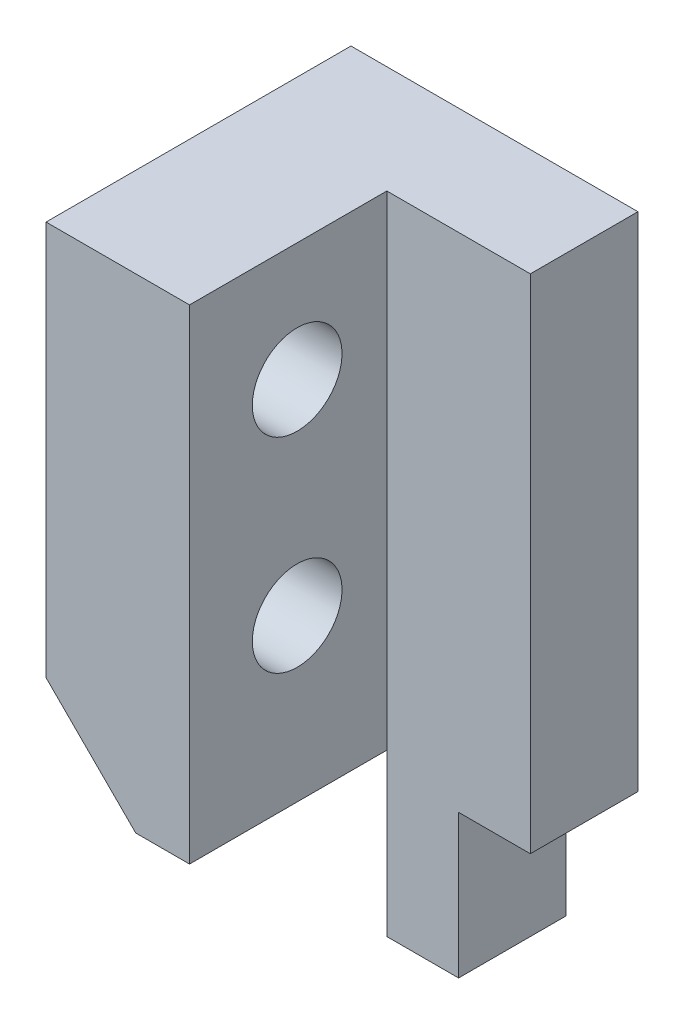
ISO-10303-21;
HEADER;
FILE_DESCRIPTION(('STEP AP214'),'2;1');
FILE_NAME('part.step','',(''),(''),'','','');
FILE_SCHEMA(('AUTOMOTIVE_DESIGN { 1 0 10303 214 1 1 1 1 }'));
ENDSEC;
DATA;
#1=APPLICATION_CONTEXT('core data for automotive mechanical design processes');
#2=APPLICATION_PROTOCOL_DEFINITION('international standard','automotive_design',2000,#1);
#3=PRODUCT_CONTEXT('',#1,'mechanical');
#4=PRODUCT('Part','Part','',(#3));
#5=PRODUCT_RELATED_PRODUCT_CATEGORY('part','',(#4));
#6=PRODUCT_DEFINITION_FORMATION('','',#4);
#7=PRODUCT_DEFINITION_CONTEXT('part definition',#1,'design');
#8=PRODUCT_DEFINITION('design','',#6,#7);
#9=PRODUCT_DEFINITION_SHAPE('','',#8);
#10=(LENGTH_UNIT() NAMED_UNIT(*) SI_UNIT(.MILLI.,.METRE.));
#11=(NAMED_UNIT(*) PLANE_ANGLE_UNIT() SI_UNIT($,.RADIAN.));
#12=(NAMED_UNIT(*) SI_UNIT($,.STERADIAN.) SOLID_ANGLE_UNIT());
#13=UNCERTAINTY_MEASURE_WITH_UNIT(LENGTH_MEASURE(1.E-05),#10,'distance_accuracy_value','');
#14=(GEOMETRIC_REPRESENTATION_CONTEXT(3) GLOBAL_UNCERTAINTY_ASSIGNED_CONTEXT((#13)) GLOBAL_UNIT_ASSIGNED_CONTEXT((#10,
#11,#12)) REPRESENTATION_CONTEXT('',''));
#15=CARTESIAN_POINT('',(0.,0.,0.));
#16=DIRECTION('',(0.,0.,1.));
#17=DIRECTION('',(1.,0.,0.));
#18=AXIS2_PLACEMENT_3D('',#15,#16,#17);
#19=CARTESIAN_POINT('',(0.,0.,8.5));
#20=DIRECTION('',(1.,0.,0.));
#21=DIRECTION('',(0.,0.,-1.));
#22=AXIS2_PLACEMENT_3D('',#19,#20,#21);
#23=PLANE('',#22);
#24=CARTESIAN_POINT('',(0.,14.7,5.5));
#25=DIRECTION('',(-1.,0.,0.));
#26=DIRECTION('',(0.,0.,1.));
#27=AXIS2_PLACEMENT_3D('',#24,#25,#26);
#28=CIRCLE('',#27,1.24999999999999);
#29=CARTESIAN_POINT('',(0.,14.7,6.74999999999999));
#30=VERTEX_POINT('',#29);
#31=EDGE_CURVE('E171',#30,#30,#28,.T.);
#32=ORIENTED_EDGE('',*,*,#31,.F.);
#33=EDGE_LOOP('',(#32));
#34=FACE_BOUND('',#33,.T.);
#35=CARTESIAN_POINT('',(0.,9.,5.5));
#36=DIRECTION('',(-1.,0.,0.));
#37=DIRECTION('',(0.,0.,1.));
#38=AXIS2_PLACEMENT_3D('',#35,#36,#37);
#39=CIRCLE('',#38,1.24999999999999);
#40=CARTESIAN_POINT('',(0.,9.,6.74999999999999));
#41=VERTEX_POINT('',#40);
#42=EDGE_CURVE('E170',#41,#41,#39,.T.);
#43=ORIENTED_EDGE('',*,*,#42,.F.);
#44=EDGE_LOOP('',(#43));
#45=FACE_BOUND('',#44,.T.);
#46=DIRECTION('',(0.,-1.,0.));
#47=VECTOR('',#46,1.);
#48=CARTESIAN_POINT('',(0.,0.,0.));
#49=LINE('',#48,#47);
#50=CARTESIAN_POINT('',(0.,18.,0.));
#51=VERTEX_POINT('',#50);
#52=CARTESIAN_POINT('',(0.,7.00000000000001,0.));
#53=VERTEX_POINT('',#52);
#54=EDGE_CURVE('E138',#51,#53,#49,.T.);
#55=ORIENTED_EDGE('',*,*,#54,.T.);
#56=DIRECTION('',(0.,0.,1.));
#57=VECTOR('',#56,1.);
#58=CARTESIAN_POINT('',(0.,7.00000000000001,8.5));
#59=LINE('',#58,#57);
#60=CARTESIAN_POINT('',(0.,7.00000000000001,8.5));
#61=VERTEX_POINT('',#60);
#62=EDGE_CURVE('E41',#53,#61,#59,.T.);
#63=ORIENTED_EDGE('',*,*,#62,.T.);
#64=DIRECTION('',(0.,-1.,0.));
#65=VECTOR('',#64,1.);
#66=CARTESIAN_POINT('',(0.,0.,8.5));
#67=LINE('',#66,#65);
#68=CARTESIAN_POINT('',(0.,18.,8.5));
#69=VERTEX_POINT('',#68);
#70=EDGE_CURVE('E151',#69,#61,#67,.T.);
#71=ORIENTED_EDGE('',*,*,#70,.F.);
#72=DIRECTION('',(0.,0.,-1.));
#73=VECTOR('',#72,1.);
#74=CARTESIAN_POINT('',(0.,18.,8.5));
#75=LINE('',#74,#73);
#76=EDGE_CURVE('E155',#69,#51,#75,.T.);
#77=ORIENTED_EDGE('',*,*,#76,.T.);
#78=EDGE_LOOP('',(#55,#63,#71,#77));
#79=FACE_BOUND('',#78,.T.);
#80=ADVANCED_FACE('F33',(#34,#45,#79),#23,.F.);
#81=CARTESIAN_POINT('',(0.,0.,8.5));
#82=DIRECTION('',(0.,1.,0.));
#83=DIRECTION('',(0.,0.,1.));
#84=AXIS2_PLACEMENT_3D('',#81,#82,#83);
#85=PLANE('',#84);
#86=DIRECTION('',(-1.,0.,0.));
#87=VECTOR('',#86,1.);
#88=CARTESIAN_POINT('',(8.,0.,3.));
#89=LINE('',#88,#87);
#90=CARTESIAN_POINT('',(6.,0.,3.));
#91=VERTEX_POINT('',#90);
#92=CARTESIAN_POINT('',(4.,0.,3.));
#93=VERTEX_POINT('',#92);
#94=EDGE_CURVE('E150',#91,#93,#89,.T.);
#95=ORIENTED_EDGE('',*,*,#94,.T.);
#96=DIRECTION('',(0.,0.,-1.));
#97=VECTOR('',#96,1.);
#98=CARTESIAN_POINT('',(4.,0.,8.5));
#99=LINE('',#98,#97);
#100=CARTESIAN_POINT('',(4.,0.,0.));
#101=VERTEX_POINT('',#100);
#102=EDGE_CURVE('E132',#93,#101,#99,.T.);
#103=ORIENTED_EDGE('',*,*,#102,.T.);
#104=DIRECTION('',(1.,0.,0.));
#105=VECTOR('',#104,1.);
#106=CARTESIAN_POINT('',(0.,0.,0.));
#107=LINE('',#106,#105);
#108=CARTESIAN_POINT('',(6.,0.,0.));
#109=VERTEX_POINT('',#108);
#110=EDGE_CURVE('E141',#101,#109,#107,.T.);
#111=ORIENTED_EDGE('',*,*,#110,.T.);
#112=DIRECTION('',(0.,0.,1.));
#113=VECTOR('',#112,1.);
#114=CARTESIAN_POINT('',(6.,0.,0.));
#115=LINE('',#114,#113);
#116=EDGE_CURVE('E195',#109,#91,#115,.T.);
#117=ORIENTED_EDGE('',*,*,#116,.T.);
#118=EDGE_LOOP('',(#95,#103,#111,#117));
#119=FACE_BOUND('',#118,.T.);
#120=ADVANCED_FACE('F227',(#119),#85,.F.);
#121=CARTESIAN_POINT('',(8.,0.,8.5));
#122=DIRECTION('',(-1.,0.,0.));
#123=DIRECTION('',(0.,0.,1.));
#124=AXIS2_PLACEMENT_3D('',#121,#122,#123);
#125=PLANE('',#124);
#126=DIRECTION('',(0.,1.,0.));
#127=VECTOR('',#126,1.);
#128=CARTESIAN_POINT('',(8.,0.,3.));
#129=LINE('',#128,#127);
#130=CARTESIAN_POINT('',(8.,4.,3.));
#131=VERTEX_POINT('',#130);
#132=CARTESIAN_POINT('',(8.,18.,3.));
#133=VERTEX_POINT('',#132);
#134=EDGE_CURVE('E148',#131,#133,#129,.T.);
#135=ORIENTED_EDGE('',*,*,#134,.F.);
#136=DIRECTION('',(0.,0.,1.));
#137=VECTOR('',#136,1.);
#138=CARTESIAN_POINT('',(8.,4.,0.));
#139=LINE('',#138,#137);
#140=CARTESIAN_POINT('',(8.,4.,0.));
#141=VERTEX_POINT('',#140);
#142=EDGE_CURVE('E191',#141,#131,#139,.T.);
#143=ORIENTED_EDGE('',*,*,#142,.F.);
#144=DIRECTION('',(0.,1.,0.));
#145=VECTOR('',#144,1.);
#146=CARTESIAN_POINT('',(8.,0.,0.));
#147=LINE('',#146,#145);
#148=CARTESIAN_POINT('',(8.,18.,0.));
#149=VERTEX_POINT('',#148);
#150=EDGE_CURVE('E158',#141,#149,#147,.T.);
#151=ORIENTED_EDGE('',*,*,#150,.T.);
#152=DIRECTION('',(0.,0.,-1.));
#153=VECTOR('',#152,1.);
#154=CARTESIAN_POINT('',(8.,18.,8.5));
#155=LINE('',#154,#153);
#156=EDGE_CURVE('E163',#133,#149,#155,.T.);
#157=ORIENTED_EDGE('',*,*,#156,.F.);
#158=EDGE_LOOP('',(#135,#143,#151,#157));
#159=FACE_BOUND('',#158,.T.);
#160=ADVANCED_FACE('F232',(#159),#125,.F.);
#161=CARTESIAN_POINT('',(0.,18.,8.5));
#162=DIRECTION('',(0.,-1.,0.));
#163=DIRECTION('',(0.,0.,-1.));
#164=AXIS2_PLACEMENT_3D('',#161,#162,#163);
#165=PLANE('',#164);
#166=DIRECTION('',(-1.,0.,0.));
#167=VECTOR('',#166,1.);
#168=CARTESIAN_POINT('',(0.,18.,8.5));
#169=LINE('',#168,#167);
#170=CARTESIAN_POINT('',(4.,18.,8.5));
#171=VERTEX_POINT('',#170);
#172=EDGE_CURVE('E153',#171,#69,#169,.T.);
#173=ORIENTED_EDGE('',*,*,#172,.F.);
#174=DIRECTION('',(0.,0.,1.));
#175=VECTOR('',#174,1.);
#176=CARTESIAN_POINT('',(4.,18.,8.5));
#177=LINE('',#176,#175);
#178=CARTESIAN_POINT('',(4.,18.,3.));
#179=VERTEX_POINT('',#178);
#180=EDGE_CURVE('E136',#179,#171,#177,.T.);
#181=ORIENTED_EDGE('',*,*,#180,.F.);
#182=DIRECTION('',(-1.,0.,0.));
#183=VECTOR('',#182,1.);
#184=CARTESIAN_POINT('',(8.,18.,3.));
#185=LINE('',#184,#183);
#186=EDGE_CURVE('E208',#133,#179,#185,.T.);
#187=ORIENTED_EDGE('',*,*,#186,.F.);
#188=ORIENTED_EDGE('',*,*,#156,.T.);
#189=DIRECTION('',(-1.,0.,0.));
#190=VECTOR('',#189,1.);
#191=CARTESIAN_POINT('',(0.,18.,0.));
#192=LINE('',#191,#190);
#193=EDGE_CURVE('E154',#149,#51,#192,.T.);
#194=ORIENTED_EDGE('',*,*,#193,.T.);
#195=ORIENTED_EDGE('',*,*,#76,.F.);
#196=EDGE_LOOP('',(#173,#181,#187,#188,#194,#195));
#197=FACE_BOUND('',#196,.T.);
#198=ADVANCED_FACE('F218',(#197),#165,.F.);
#199=CARTESIAN_POINT('',(0.,18.,8.5));
#200=DIRECTION('',(0.,0.,-1.));
#201=DIRECTION('',(-1.,0.,0.));
#202=AXIS2_PLACEMENT_3D('',#199,#200,#201);
#203=PLANE('',#202);
#204=ORIENTED_EDGE('',*,*,#70,.T.);
#205=DIRECTION('',(-0.707106781186546,0.707106781186549,0.));
#206=VECTOR('',#205,1.);
#207=CARTESIAN_POINT('',(2.5,4.5,8.5));
#208=LINE('',#207,#206);
#209=CARTESIAN_POINT('',(2.5,4.5,8.5));
#210=VERTEX_POINT('',#209);
#211=EDGE_CURVE('E11',#61,#210,#208,.F.);
#212=ORIENTED_EDGE('',*,*,#211,.T.);
#213=DIRECTION('',(1.,0.,0.));
#214=VECTOR('',#213,1.);
#215=CARTESIAN_POINT('',(0.,4.5,8.5));
#216=LINE('',#215,#214);
#217=CARTESIAN_POINT('',(4.,4.5,8.5));
#218=VERTEX_POINT('',#217);
#219=EDGE_CURVE('E112',#210,#218,#216,.T.);
#220=ORIENTED_EDGE('',*,*,#219,.T.);
#221=DIRECTION('',(0.,1.,0.));
#222=VECTOR('',#221,1.);
#223=CARTESIAN_POINT('',(4.,0.,8.5));
#224=LINE('',#223,#222);
#225=EDGE_CURVE('E116',#218,#171,#224,.T.);
#226=ORIENTED_EDGE('',*,*,#225,.T.);
#227=ORIENTED_EDGE('',*,*,#172,.T.);
#228=EDGE_LOOP('',(#204,#212,#220,#226,#227));
#229=FACE_BOUND('',#228,.T.);
#230=ADVANCED_FACE('F114',(#229),#203,.F.);
#231=CARTESIAN_POINT('',(0.,18.,0.));
#232=DIRECTION('',(0.,0.,-1.));
#233=DIRECTION('',(-1.,0.,0.));
#234=AXIS2_PLACEMENT_3D('',#231,#232,#233);
#235=PLANE('',#234);
#236=DIRECTION('',(1.,0.,0.));
#237=VECTOR('',#236,1.);
#238=CARTESIAN_POINT('',(0.,4.5,0.));
#239=LINE('',#238,#237);
#240=CARTESIAN_POINT('',(2.5,4.5,0.));
#241=VERTEX_POINT('',#240);
#242=CARTESIAN_POINT('',(4.,4.5,0.));
#243=VERTEX_POINT('',#242);
#244=EDGE_CURVE('E173',#241,#243,#239,.T.);
#245=ORIENTED_EDGE('',*,*,#244,.F.);
#246=DIRECTION('',(0.707106781186546,-0.707106781186549,0.));
#247=VECTOR('',#246,1.);
#248=CARTESIAN_POINT('',(-5.5,12.5,0.));
#249=LINE('',#248,#247);
#250=EDGE_CURVE('E55',#241,#53,#249,.F.);
#251=ORIENTED_EDGE('',*,*,#250,.T.);
#252=ORIENTED_EDGE('',*,*,#54,.F.);
#253=ORIENTED_EDGE('',*,*,#193,.F.);
#254=ORIENTED_EDGE('',*,*,#150,.F.);
#255=DIRECTION('',(-1.,0.,0.));
#256=VECTOR('',#255,1.);
#257=CARTESIAN_POINT('',(8.,4.,0.));
#258=LINE('',#257,#256);
#259=CARTESIAN_POINT('',(6.,4.,0.));
#260=VERTEX_POINT('',#259);
#261=EDGE_CURVE('E184',#141,#260,#258,.T.);
#262=ORIENTED_EDGE('',*,*,#261,.T.);
#263=DIRECTION('',(0.,-1.,0.));
#264=VECTOR('',#263,1.);
#265=CARTESIAN_POINT('',(6.,0.,0.));
#266=LINE('',#265,#264);
#267=EDGE_CURVE('E187',#260,#109,#266,.T.);
#268=ORIENTED_EDGE('',*,*,#267,.T.);
#269=ORIENTED_EDGE('',*,*,#110,.F.);
#270=DIRECTION('',(0.,-1.,0.));
#271=VECTOR('',#270,1.);
#272=CARTESIAN_POINT('',(4.,0.,0.));
#273=LINE('',#272,#271);
#274=EDGE_CURVE('E123',#243,#101,#273,.T.);
#275=ORIENTED_EDGE('',*,*,#274,.F.);
#276=EDGE_LOOP('',(#245,#251,#252,#253,#254,#262,#268,#269,#275));
#277=FACE_BOUND('',#276,.T.);
#278=ADVANCED_FACE('F176',(#277),#235,.T.);
#279=CARTESIAN_POINT('',(4.,0.,8.5));
#280=DIRECTION('',(-1.,0.,0.));
#281=DIRECTION('',(0.,0.,1.));
#282=AXIS2_PLACEMENT_3D('',#279,#280,#281);
#283=PLANE('',#282);
#284=CARTESIAN_POINT('',(4.,14.7,5.5));
#285=DIRECTION('',(-1.,0.,0.));
#286=DIRECTION('',(0.,0.,1.));
#287=AXIS2_PLACEMENT_3D('',#284,#285,#286);
#288=CIRCLE('',#287,1.24999999999999);
#289=CARTESIAN_POINT('',(4.,14.7,6.74999999999999));
#290=VERTEX_POINT('',#289);
#291=EDGE_CURVE('E167',#290,#290,#288,.T.);
#292=ORIENTED_EDGE('',*,*,#291,.T.);
#293=EDGE_LOOP('',(#292));
#294=FACE_BOUND('',#293,.T.);
#295=CARTESIAN_POINT('',(4.,9.,5.5));
#296=DIRECTION('',(-1.,0.,0.));
#297=DIRECTION('',(0.,0.,1.));
#298=AXIS2_PLACEMENT_3D('',#295,#296,#297);
#299=CIRCLE('',#298,1.24999999999999);
#300=CARTESIAN_POINT('',(4.,9.,6.74999999999999));
#301=VERTEX_POINT('',#300);
#302=EDGE_CURVE('E205',#301,#301,#299,.T.);
#303=ORIENTED_EDGE('',*,*,#302,.T.);
#304=EDGE_LOOP('',(#303));
#305=FACE_BOUND('',#304,.T.);
#306=ORIENTED_EDGE('',*,*,#225,.F.);
#307=DIRECTION('',(0.,0.,-1.));
#308=VECTOR('',#307,1.);
#309=CARTESIAN_POINT('',(4.,4.5,8.5));
#310=LINE('',#309,#308);
#311=CARTESIAN_POINT('',(4.,4.5,3.));
#312=VERTEX_POINT('',#311);
#313=EDGE_CURVE('E127',#218,#312,#310,.T.);
#314=ORIENTED_EDGE('',*,*,#313,.T.);
#315=DIRECTION('',(0.,1.,0.));
#316=VECTOR('',#315,1.);
#317=CARTESIAN_POINT('',(4.,0.,3.));
#318=LINE('',#317,#316);
#319=EDGE_CURVE('E143',#312,#179,#318,.T.);
#320=ORIENTED_EDGE('',*,*,#319,.T.);
#321=ORIENTED_EDGE('',*,*,#180,.T.);
#322=EDGE_LOOP('',(#306,#314,#320,#321));
#323=FACE_BOUND('',#322,.T.);
#324=ADVANCED_FACE('F134',(#294,#305,#323),#283,.F.);
#325=CARTESIAN_POINT('',(8.,0.,3.));
#326=DIRECTION('',(0.,0.,-1.));
#327=DIRECTION('',(-1.,0.,0.));
#328=AXIS2_PLACEMENT_3D('',#325,#326,#327);
#329=PLANE('',#328);
#330=EDGE_CURVE('E139',#93,#312,#318,.T.);
#331=ORIENTED_EDGE('',*,*,#330,.F.);
#332=ORIENTED_EDGE('',*,*,#94,.F.);
#333=DIRECTION('',(0.,-1.,0.));
#334=VECTOR('',#333,1.);
#335=CARTESIAN_POINT('',(6.,0.,3.));
#336=LINE('',#335,#334);
#337=CARTESIAN_POINT('',(6.,4.,3.));
#338=VERTEX_POINT('',#337);
#339=EDGE_CURVE('E188',#338,#91,#336,.T.);
#340=ORIENTED_EDGE('',*,*,#339,.F.);
#341=DIRECTION('',(-1.,0.,0.));
#342=VECTOR('',#341,1.);
#343=CARTESIAN_POINT('',(8.,4.,3.));
#344=LINE('',#343,#342);
#345=EDGE_CURVE('E182',#131,#338,#344,.T.);
#346=ORIENTED_EDGE('',*,*,#345,.F.);
#347=ORIENTED_EDGE('',*,*,#134,.T.);
#348=ORIENTED_EDGE('',*,*,#186,.T.);
#349=ORIENTED_EDGE('',*,*,#319,.F.);
#350=EDGE_LOOP('',(#331,#332,#340,#346,#347,#348,#349));
#351=FACE_BOUND('',#350,.T.);
#352=ADVANCED_FACE('F213',(#351),#329,.F.);
#353=CARTESIAN_POINT('',(0.,9.,5.5));
#354=DIRECTION('',(-1.,0.,0.));
#355=DIRECTION('',(0.,0.,1.));
#356=AXIS2_PLACEMENT_3D('',#353,#354,#355);
#357=CYLINDRICAL_SURFACE('',#356,1.24999999999999);
#358=ORIENTED_EDGE('',*,*,#42,.T.);
#359=EDGE_LOOP('',(#358));
#360=FACE_BOUND('',#359,.T.);
#361=ORIENTED_EDGE('',*,*,#302,.F.);
#362=EDGE_LOOP('',(#361));
#363=FACE_BOUND('',#362,.T.);
#364=ADVANCED_FACE('F249',(#360,#363),#357,.F.);
#365=CARTESIAN_POINT('',(0.,14.7,5.5));
#366=DIRECTION('',(-1.,0.,0.));
#367=DIRECTION('',(0.,0.,1.));
#368=AXIS2_PLACEMENT_3D('',#365,#366,#367);
#369=CYLINDRICAL_SURFACE('',#368,1.24999999999999);
#370=ORIENTED_EDGE('',*,*,#31,.T.);
#371=EDGE_LOOP('',(#370));
#372=FACE_BOUND('',#371,.T.);
#373=ORIENTED_EDGE('',*,*,#291,.F.);
#374=EDGE_LOOP('',(#373));
#375=FACE_BOUND('',#374,.T.);
#376=ADVANCED_FACE('F255',(#372,#375),#369,.F.);
#377=CARTESIAN_POINT('',(6.,0.,0.));
#378=DIRECTION('',(-1.,0.,0.));
#379=DIRECTION('',(0.,0.,1.));
#380=AXIS2_PLACEMENT_3D('',#377,#378,#379);
#381=PLANE('',#380);
#382=ORIENTED_EDGE('',*,*,#339,.T.);
#383=ORIENTED_EDGE('',*,*,#116,.F.);
#384=ORIENTED_EDGE('',*,*,#267,.F.);
#385=DIRECTION('',(0.,0.,1.));
#386=VECTOR('',#385,1.);
#387=CARTESIAN_POINT('',(6.,4.,0.));
#388=LINE('',#387,#386);
#389=EDGE_CURVE('E198',#260,#338,#388,.T.);
#390=ORIENTED_EDGE('',*,*,#389,.T.);
#391=EDGE_LOOP('',(#382,#383,#384,#390));
#392=FACE_BOUND('',#391,.T.);
#393=ADVANCED_FACE('F259',(#392),#381,.F.);
#394=CARTESIAN_POINT('',(8.,4.,0.));
#395=DIRECTION('',(0.,1.,0.));
#396=DIRECTION('',(0.,0.,1.));
#397=AXIS2_PLACEMENT_3D('',#394,#395,#396);
#398=PLANE('',#397);
#399=ORIENTED_EDGE('',*,*,#345,.T.);
#400=ORIENTED_EDGE('',*,*,#389,.F.);
#401=ORIENTED_EDGE('',*,*,#261,.F.);
#402=ORIENTED_EDGE('',*,*,#142,.T.);
#403=EDGE_LOOP('',(#399,#400,#401,#402));
#404=FACE_BOUND('',#403,.T.);
#405=ADVANCED_FACE('F261',(#404),#398,.F.);
#406=CARTESIAN_POINT('',(4.,0.,8.5));
#407=DIRECTION('',(1.,0.,0.));
#408=DIRECTION('',(0.,0.,-1.));
#409=AXIS2_PLACEMENT_3D('',#406,#407,#408);
#410=PLANE('',#409);
#411=EDGE_CURVE('E122',#312,#243,#310,.T.);
#412=ORIENTED_EDGE('',*,*,#411,.T.);
#413=ORIENTED_EDGE('',*,*,#274,.T.);
#414=ORIENTED_EDGE('',*,*,#102,.F.);
#415=ORIENTED_EDGE('',*,*,#330,.T.);
#416=EDGE_LOOP('',(#412,#413,#414,#415));
#417=FACE_BOUND('',#416,.T.);
#418=ADVANCED_FACE('F224',(#417),#410,.F.);
#419=CARTESIAN_POINT('',(0.,4.5,8.5));
#420=DIRECTION('',(0.,1.,0.));
#421=DIRECTION('',(-1.,0.,0.));
#422=AXIS2_PLACEMENT_3D('',#419,#420,#421);
#423=PLANE('',#422);
#424=ORIENTED_EDGE('',*,*,#219,.F.);
#425=DIRECTION('',(0.,0.,-1.));
#426=VECTOR('',#425,1.);
#427=CARTESIAN_POINT('',(2.5,4.5,8.5));
#428=LINE('',#427,#426);
#429=EDGE_CURVE('E166',#210,#241,#428,.T.);
#430=ORIENTED_EDGE('',*,*,#429,.T.);
#431=ORIENTED_EDGE('',*,*,#244,.T.);
#432=ORIENTED_EDGE('',*,*,#411,.F.);
#433=ORIENTED_EDGE('',*,*,#313,.F.);
#434=EDGE_LOOP('',(#424,#430,#431,#432,#433));
#435=FACE_BOUND('',#434,.T.);
#436=ADVANCED_FACE('F128',(#435),#423,.F.);
#437=CARTESIAN_POINT('',(2.5,4.5,8.5));
#438=DIRECTION('',(0.707106781186549,0.707106781186546,0.));
#439=DIRECTION('',(-0.707106781186546,0.707106781186549,0.));
#440=AXIS2_PLACEMENT_3D('',#437,#438,#439);
#441=PLANE('',#440);
#442=ORIENTED_EDGE('',*,*,#211,.F.);
#443=ORIENTED_EDGE('',*,*,#62,.F.);
#444=ORIENTED_EDGE('',*,*,#250,.F.);
#445=ORIENTED_EDGE('',*,*,#429,.F.);
#446=EDGE_LOOP('',(#442,#443,#444,#445));
#447=FACE_BOUND('',#446,.T.);
#448=ADVANCED_FACE('F35',(#447),#441,.F.);
#449=CLOSED_SHELL('',(#80,#120,#160,#198,#230,#278,#324,#352,#364,#376,#393,#405,#418,#436,#448));
#450=MANIFOLD_SOLID_BREP('B2',#449);
#451=ADVANCED_BREP_SHAPE_REPRESENTATION('',(#18,#450),#14);
#452=SHAPE_DEFINITION_REPRESENTATION(#9,#451);
ENDSEC;
END-ISO-10303-21;
